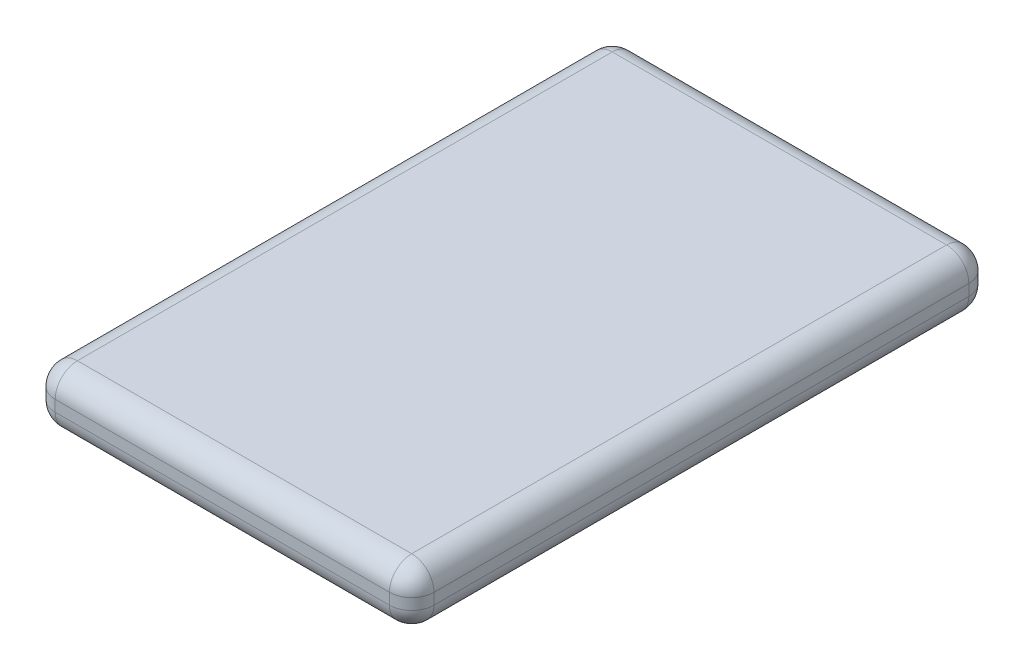
ISO-10303-21;
HEADER;
FILE_DESCRIPTION(('STEP AP214'),'2;1');
FILE_NAME('part.step','',(''),(''),'','','');
FILE_SCHEMA(('AUTOMOTIVE_DESIGN { 1 0 10303 214 1 1 1 1 }'));
ENDSEC;
DATA;
#1=APPLICATION_CONTEXT('core data for automotive mechanical design processes');
#2=APPLICATION_PROTOCOL_DEFINITION('international standard','automotive_design',2000,#1);
#3=PRODUCT_CONTEXT('',#1,'mechanical');
#4=PRODUCT('Part','Part','',(#3));
#5=PRODUCT_RELATED_PRODUCT_CATEGORY('part','',(#4));
#6=PRODUCT_DEFINITION_FORMATION('','',#4);
#7=PRODUCT_DEFINITION_CONTEXT('part definition',#1,'design');
#8=PRODUCT_DEFINITION('design','',#6,#7);
#9=PRODUCT_DEFINITION_SHAPE('','',#8);
#10=(LENGTH_UNIT() NAMED_UNIT(*) SI_UNIT(.MILLI.,.METRE.));
#11=(NAMED_UNIT(*) PLANE_ANGLE_UNIT() SI_UNIT($,.RADIAN.));
#12=(NAMED_UNIT(*) SI_UNIT($,.STERADIAN.) SOLID_ANGLE_UNIT());
#13=UNCERTAINTY_MEASURE_WITH_UNIT(LENGTH_MEASURE(1.E-05),#10,'distance_accuracy_value','');
#14=(GEOMETRIC_REPRESENTATION_CONTEXT(3) GLOBAL_UNCERTAINTY_ASSIGNED_CONTEXT((#13)) GLOBAL_UNIT_ASSIGNED_CONTEXT((#10,
#11,#12)) REPRESENTATION_CONTEXT('',''));
#15=CARTESIAN_POINT('',(0.,0.,0.));
#16=DIRECTION('',(0.,0.,1.));
#17=DIRECTION('',(1.,0.,0.));
#18=AXIS2_PLACEMENT_3D('',#15,#16,#17);
#19=CARTESIAN_POINT('',(0.,5.,0.));
#20=DIRECTION('',(1.,0.,0.));
#21=DIRECTION('',(0.,0.,-1.));
#22=AXIS2_PLACEMENT_3D('',#19,#20,#21);
#23=PLANE('',#22);
#24=DIRECTION('',(0.,-1.,0.));
#25=VECTOR('',#24,1.);
#26=CARTESIAN_POINT('',(0.,5.,-2.));
#27=LINE('',#26,#25);
#28=CARTESIAN_POINT('',(0.,2.,-2.));
#29=VERTEX_POINT('',#28);
#30=CARTESIAN_POINT('',(0.,3.,-2.));
#31=VERTEX_POINT('',#30);
#32=EDGE_CURVE('E219',#29,#31,#27,.F.);
#33=ORIENTED_EDGE('',*,*,#32,.T.);
#34=DIRECTION('',(0.,0.,1.));
#35=VECTOR('',#34,1.);
#36=CARTESIAN_POINT('',(0.,3.,0.));
#37=LINE('',#36,#35);
#38=CARTESIAN_POINT('',(0.,3.,-50.));
#39=VERTEX_POINT('',#38);
#40=EDGE_CURVE('E222',#31,#39,#37,.F.);
#41=ORIENTED_EDGE('',*,*,#40,.T.);
#42=DIRECTION('',(0.,-1.,0.));
#43=VECTOR('',#42,1.);
#44=CARTESIAN_POINT('',(0.,5.,-50.));
#45=LINE('',#44,#43);
#46=CARTESIAN_POINT('',(0.,2.,-50.));
#47=VERTEX_POINT('',#46);
#48=EDGE_CURVE('E213',#39,#47,#45,.T.);
#49=ORIENTED_EDGE('',*,*,#48,.T.);
#50=DIRECTION('',(0.,0.,1.));
#51=VECTOR('',#50,1.);
#52=CARTESIAN_POINT('',(0.,2.,0.));
#53=LINE('',#52,#51);
#54=EDGE_CURVE('E216',#47,#29,#53,.T.);
#55=ORIENTED_EDGE('',*,*,#54,.T.);
#56=EDGE_LOOP('',(#33,#41,#49,#55));
#57=FACE_BOUND('',#56,.T.);
#58=ADVANCED_FACE('F43',(#57),#23,.F.);
#59=CARTESIAN_POINT('',(0.,5.,0.));
#60=DIRECTION('',(0.,0.,-1.));
#61=DIRECTION('',(-1.,0.,0.));
#62=AXIS2_PLACEMENT_3D('',#59,#60,#61);
#63=PLANE('',#62);
#64=DIRECTION('',(0.,-1.,0.));
#65=VECTOR('',#64,1.);
#66=CARTESIAN_POINT('',(32.,5.,0.));
#67=LINE('',#66,#65);
#68=CARTESIAN_POINT('',(32.,2.,0.));
#69=VERTEX_POINT('',#68);
#70=CARTESIAN_POINT('',(32.,3.,0.));
#71=VERTEX_POINT('',#70);
#72=EDGE_CURVE('E206',#69,#71,#67,.F.);
#73=ORIENTED_EDGE('',*,*,#72,.T.);
#74=DIRECTION('',(1.,0.,0.));
#75=VECTOR('',#74,1.);
#76=CARTESIAN_POINT('',(0.,3.,0.));
#77=LINE('',#76,#75);
#78=CARTESIAN_POINT('',(2.,3.,0.));
#79=VERTEX_POINT('',#78);
#80=EDGE_CURVE('E209',#71,#79,#77,.F.);
#81=ORIENTED_EDGE('',*,*,#80,.T.);
#82=DIRECTION('',(0.,-1.,0.));
#83=VECTOR('',#82,1.);
#84=CARTESIAN_POINT('',(2.,5.,0.));
#85=LINE('',#84,#83);
#86=CARTESIAN_POINT('',(2.,2.,0.));
#87=VERTEX_POINT('',#86);
#88=EDGE_CURVE('E200',#79,#87,#85,.T.);
#89=ORIENTED_EDGE('',*,*,#88,.T.);
#90=DIRECTION('',(1.,0.,0.));
#91=VECTOR('',#90,1.);
#92=CARTESIAN_POINT('',(34.,2.,0.));
#93=LINE('',#92,#91);
#94=EDGE_CURVE('E203',#87,#69,#93,.T.);
#95=ORIENTED_EDGE('',*,*,#94,.T.);
#96=EDGE_LOOP('',(#73,#81,#89,#95));
#97=FACE_BOUND('',#96,.T.);
#98=ADVANCED_FACE('F326',(#97),#63,.F.);
#99=CARTESIAN_POINT('',(34.,5.,0.));
#100=DIRECTION('',(-1.,0.,0.));
#101=DIRECTION('',(0.,0.,1.));
#102=AXIS2_PLACEMENT_3D('',#99,#100,#101);
#103=PLANE('',#102);
#104=DIRECTION('',(0.,0.,-1.));
#105=VECTOR('',#104,1.);
#106=CARTESIAN_POINT('',(34.,3.,0.));
#107=LINE('',#106,#105);
#108=CARTESIAN_POINT('',(34.,3.,-50.));
#109=VERTEX_POINT('',#108);
#110=CARTESIAN_POINT('',(34.,3.,-2.));
#111=VERTEX_POINT('',#110);
#112=EDGE_CURVE('E140',#109,#111,#107,.F.);
#113=ORIENTED_EDGE('',*,*,#112,.T.);
#114=DIRECTION('',(0.,-1.,0.));
#115=VECTOR('',#114,1.);
#116=CARTESIAN_POINT('',(34.,5.,-2.));
#117=LINE('',#116,#115);
#118=CARTESIAN_POINT('',(34.,2.,-2.));
#119=VERTEX_POINT('',#118);
#120=EDGE_CURVE('E184',#111,#119,#117,.T.);
#121=ORIENTED_EDGE('',*,*,#120,.T.);
#122=DIRECTION('',(0.,0.,-1.));
#123=VECTOR('',#122,1.);
#124=CARTESIAN_POINT('',(34.,2.,-52.));
#125=LINE('',#124,#123);
#126=CARTESIAN_POINT('',(34.,2.,-50.));
#127=VERTEX_POINT('',#126);
#128=EDGE_CURVE('E175',#119,#127,#125,.T.);
#129=ORIENTED_EDGE('',*,*,#128,.T.);
#130=DIRECTION('',(0.,-1.,0.));
#131=VECTOR('',#130,1.);
#132=CARTESIAN_POINT('',(34.,5.,-50.));
#133=LINE('',#132,#131);
#134=EDGE_CURVE('E171',#127,#109,#133,.F.);
#135=ORIENTED_EDGE('',*,*,#134,.T.);
#136=EDGE_LOOP('',(#113,#121,#129,#135));
#137=FACE_BOUND('',#136,.T.);
#138=ADVANCED_FACE('F387',(#137),#103,.F.);
#139=CARTESIAN_POINT('',(0.,5.,-52.));
#140=DIRECTION('',(0.,0.,1.));
#141=DIRECTION('',(1.,0.,0.));
#142=AXIS2_PLACEMENT_3D('',#139,#140,#141);
#143=PLANE('',#142);
#144=DIRECTION('',(-1.,0.,0.));
#145=VECTOR('',#144,1.);
#146=CARTESIAN_POINT('',(0.,3.,-52.));
#147=LINE('',#146,#145);
#148=CARTESIAN_POINT('',(2.,3.,-52.));
#149=VERTEX_POINT('',#148);
#150=CARTESIAN_POINT('',(32.,3.,-52.));
#151=VERTEX_POINT('',#150);
#152=EDGE_CURVE('E53',#149,#151,#147,.F.);
#153=ORIENTED_EDGE('',*,*,#152,.T.);
#154=DIRECTION('',(0.,-1.,0.));
#155=VECTOR('',#154,1.);
#156=CARTESIAN_POINT('',(32.,5.,-52.));
#157=LINE('',#156,#155);
#158=CARTESIAN_POINT('',(32.,2.,-52.));
#159=VERTEX_POINT('',#158);
#160=EDGE_CURVE('E11',#151,#159,#157,.T.);
#161=ORIENTED_EDGE('',*,*,#160,.T.);
#162=DIRECTION('',(-1.,0.,0.));
#163=VECTOR('',#162,1.);
#164=CARTESIAN_POINT('',(0.,2.,-52.));
#165=LINE('',#164,#163);
#166=CARTESIAN_POINT('',(2.,2.,-52.));
#167=VERTEX_POINT('',#166);
#168=EDGE_CURVE('E226',#159,#167,#165,.T.);
#169=ORIENTED_EDGE('',*,*,#168,.T.);
#170=DIRECTION('',(0.,-1.,0.));
#171=VECTOR('',#170,1.);
#172=CARTESIAN_POINT('',(2.,5.,-52.));
#173=LINE('',#172,#171);
#174=EDGE_CURVE('E64',#167,#149,#173,.F.);
#175=ORIENTED_EDGE('',*,*,#174,.T.);
#176=EDGE_LOOP('',(#153,#161,#169,#175));
#177=FACE_BOUND('',#176,.T.);
#178=ADVANCED_FACE('F414',(#177),#143,.F.);
#179=CARTESIAN_POINT('',(0.,5.,0.));
#180=DIRECTION('',(0.,-1.,0.));
#181=DIRECTION('',(0.,0.,-1.));
#182=AXIS2_PLACEMENT_3D('',#179,#180,#181);
#183=PLANE('',#182);
#184=DIRECTION('',(1.,0.,0.));
#185=VECTOR('',#184,1.);
#186=CARTESIAN_POINT('',(0.,5.,-2.));
#187=LINE('',#186,#185);
#188=CARTESIAN_POINT('',(2.,5.,-2.));
#189=VERTEX_POINT('',#188);
#190=CARTESIAN_POINT('',(32.,5.,-2.));
#191=VERTEX_POINT('',#190);
#192=EDGE_CURVE('E168',#189,#191,#187,.T.);
#193=ORIENTED_EDGE('',*,*,#192,.T.);
#194=DIRECTION('',(0.,0.,-1.));
#195=VECTOR('',#194,1.);
#196=CARTESIAN_POINT('',(32.,5.,0.));
#197=LINE('',#196,#195);
#198=CARTESIAN_POINT('',(32.,5.,-50.));
#199=VERTEX_POINT('',#198);
#200=EDGE_CURVE('E138',#191,#199,#197,.T.);
#201=ORIENTED_EDGE('',*,*,#200,.T.);
#202=DIRECTION('',(-1.,0.,0.));
#203=VECTOR('',#202,1.);
#204=CARTESIAN_POINT('',(0.,5.,-50.));
#205=LINE('',#204,#203);
#206=CARTESIAN_POINT('',(2.,5.,-50.));
#207=VERTEX_POINT('',#206);
#208=EDGE_CURVE('E157',#199,#207,#205,.T.);
#209=ORIENTED_EDGE('',*,*,#208,.T.);
#210=DIRECTION('',(0.,0.,1.));
#211=VECTOR('',#210,1.);
#212=CARTESIAN_POINT('',(2.,5.,0.));
#213=LINE('',#212,#211);
#214=EDGE_CURVE('E164',#207,#189,#213,.T.);
#215=ORIENTED_EDGE('',*,*,#214,.T.);
#216=EDGE_LOOP('',(#193,#201,#209,#215));
#217=FACE_BOUND('',#216,.T.);
#218=ADVANCED_FACE('F166',(#217),#183,.F.);
#219=CARTESIAN_POINT('',(0.,0.,0.));
#220=DIRECTION('',(0.,-1.,0.));
#221=DIRECTION('',(0.,0.,-1.));
#222=AXIS2_PLACEMENT_3D('',#219,#220,#221);
#223=PLANE('',#222);
#224=DIRECTION('',(-1.,0.,0.));
#225=VECTOR('',#224,1.);
#226=CARTESIAN_POINT('',(34.,0.,-50.));
#227=LINE('',#226,#225);
#228=CARTESIAN_POINT('',(2.,0.,-50.));
#229=VERTEX_POINT('',#228);
#230=CARTESIAN_POINT('',(32.,0.,-50.));
#231=VERTEX_POINT('',#230);
#232=EDGE_CURVE('E187',#229,#231,#227,.F.);
#233=ORIENTED_EDGE('',*,*,#232,.T.);
#234=DIRECTION('',(0.,0.,-1.));
#235=VECTOR('',#234,1.);
#236=CARTESIAN_POINT('',(32.,0.,0.));
#237=LINE('',#236,#235);
#238=CARTESIAN_POINT('',(32.,0.,-2.));
#239=VERTEX_POINT('',#238);
#240=EDGE_CURVE('E196',#231,#239,#237,.F.);
#241=ORIENTED_EDGE('',*,*,#240,.T.);
#242=DIRECTION('',(1.,0.,0.));
#243=VECTOR('',#242,1.);
#244=CARTESIAN_POINT('',(0.,0.,-2.));
#245=LINE('',#244,#243);
#246=CARTESIAN_POINT('',(2.,0.,-2.));
#247=VERTEX_POINT('',#246);
#248=EDGE_CURVE('E193',#239,#247,#245,.F.);
#249=ORIENTED_EDGE('',*,*,#248,.T.);
#250=DIRECTION('',(0.,0.,1.));
#251=VECTOR('',#250,1.);
#252=CARTESIAN_POINT('',(2.,0.,-52.));
#253=LINE('',#252,#251);
#254=EDGE_CURVE('E190',#247,#229,#253,.F.);
#255=ORIENTED_EDGE('',*,*,#254,.T.);
#256=EDGE_LOOP('',(#233,#241,#249,#255));
#257=FACE_BOUND('',#256,.T.);
#258=ADVANCED_FACE('F352',(#257),#223,.T.);
#259=CARTESIAN_POINT('',(2.,2.,0.));
#260=DIRECTION('',(0.,0.,-1.));
#261=DIRECTION('',(-1.,0.,0.));
#262=AXIS2_PLACEMENT_3D('',#259,#260,#261);
#263=CYLINDRICAL_SURFACE('',#262,2.);
#264=CARTESIAN_POINT('',(2.,2.,-2.));
#265=DIRECTION('',(0.,0.,1.));
#266=DIRECTION('',(1.,0.,0.));
#267=AXIS2_PLACEMENT_3D('',#264,#265,#266);
#268=CIRCLE('',#267,2.);
#269=EDGE_CURVE('E47',#29,#247,#268,.T.);
#270=ORIENTED_EDGE('',*,*,#269,.F.);
#271=ORIENTED_EDGE('',*,*,#54,.F.);
#272=CARTESIAN_POINT('',(2.,2.,-50.));
#273=DIRECTION('',(0.,0.,-1.));
#274=DIRECTION('',(-1.,0.,0.));
#275=AXIS2_PLACEMENT_3D('',#272,#273,#274);
#276=CIRCLE('',#275,2.);
#277=EDGE_CURVE('E301',#229,#47,#276,.T.);
#278=ORIENTED_EDGE('',*,*,#277,.F.);
#279=ORIENTED_EDGE('',*,*,#254,.F.);
#280=EDGE_LOOP('',(#270,#271,#278,#279));
#281=FACE_BOUND('',#280,.T.);
#282=ADVANCED_FACE('F45',(#281),#263,.T.);
#283=CARTESIAN_POINT('',(2.,2.,-2.));
#284=DIRECTION('',(0.,-1.,0.));
#285=DIRECTION('',(0.,0.,-1.));
#286=AXIS2_PLACEMENT_3D('',#283,#284,#285);
#287=SPHERICAL_SURFACE('',#286,2.);
#288=CARTESIAN_POINT('',(2.,2.,-2.));
#289=DIRECTION('',(0.,-1.,0.));
#290=DIRECTION('',(0.,0.,-1.));
#291=AXIS2_PLACEMENT_3D('',#288,#289,#290);
#292=CIRCLE('',#291,2.);
#293=EDGE_CURVE('E294',#29,#87,#292,.F.);
#294=ORIENTED_EDGE('',*,*,#293,.F.);
#295=ORIENTED_EDGE('',*,*,#269,.T.);
#296=CARTESIAN_POINT('',(2.,2.,-2.));
#297=DIRECTION('',(-1.,0.,0.));
#298=DIRECTION('',(0.,0.,1.));
#299=AXIS2_PLACEMENT_3D('',#296,#297,#298);
#300=CIRCLE('',#299,2.);
#301=EDGE_CURVE('E298',#87,#247,#300,.F.);
#302=ORIENTED_EDGE('',*,*,#301,.F.);
#303=EDGE_LOOP('',(#294,#295,#302));
#304=FACE_BOUND('',#303,.T.);
#305=ADVANCED_FACE('F314',(#304),#287,.T.);
#306=CARTESIAN_POINT('',(2.,2.,-50.));
#307=DIRECTION('',(-1.,0.,0.));
#308=DIRECTION('',(0.,0.,1.));
#309=AXIS2_PLACEMENT_3D('',#306,#307,#308);
#310=SPHERICAL_SURFACE('',#309,2.);
#311=CARTESIAN_POINT('',(2.,2.,-50.));
#312=DIRECTION('',(-1.,0.,0.));
#313=DIRECTION('',(0.,0.,1.));
#314=AXIS2_PLACEMENT_3D('',#311,#312,#313);
#315=CIRCLE('',#314,2.);
#316=EDGE_CURVE('E286',#229,#167,#315,.F.);
#317=ORIENTED_EDGE('',*,*,#316,.F.);
#318=ORIENTED_EDGE('',*,*,#277,.T.);
#319=CARTESIAN_POINT('',(2.,2.,-50.));
#320=DIRECTION('',(0.,-1.,0.));
#321=DIRECTION('',(0.,0.,-1.));
#322=AXIS2_PLACEMENT_3D('',#319,#320,#321);
#323=CIRCLE('',#322,2.);
#324=EDGE_CURVE('E290',#167,#47,#323,.F.);
#325=ORIENTED_EDGE('',*,*,#324,.F.);
#326=EDGE_LOOP('',(#317,#318,#325));
#327=FACE_BOUND('',#326,.T.);
#328=ADVANCED_FACE('F345',(#327),#310,.T.);
#329=CARTESIAN_POINT('',(0.,2.,-2.));
#330=DIRECTION('',(-1.,0.,0.));
#331=DIRECTION('',(0.,0.,1.));
#332=AXIS2_PLACEMENT_3D('',#329,#330,#331);
#333=CYLINDRICAL_SURFACE('',#332,2.);
#334=ORIENTED_EDGE('',*,*,#301,.T.);
#335=ORIENTED_EDGE('',*,*,#248,.F.);
#336=CARTESIAN_POINT('',(32.,2.,-2.));
#337=DIRECTION('',(1.,0.,0.));
#338=DIRECTION('',(0.,0.,-1.));
#339=AXIS2_PLACEMENT_3D('',#336,#337,#338);
#340=CIRCLE('',#339,2.);
#341=EDGE_CURVE('E279',#69,#239,#340,.T.);
#342=ORIENTED_EDGE('',*,*,#341,.F.);
#343=ORIENTED_EDGE('',*,*,#94,.F.);
#344=EDGE_LOOP('',(#334,#335,#342,#343));
#345=FACE_BOUND('',#344,.T.);
#346=ADVANCED_FACE('F322',(#345),#333,.T.);
#347=CARTESIAN_POINT('',(2.,5.,-2.));
#348=DIRECTION('',(0.,-1.,0.));
#349=DIRECTION('',(0.,0.,-1.));
#350=AXIS2_PLACEMENT_3D('',#347,#348,#349);
#351=CYLINDRICAL_SURFACE('',#350,2.);
#352=ORIENTED_EDGE('',*,*,#293,.T.);
#353=ORIENTED_EDGE('',*,*,#88,.F.);
#354=CARTESIAN_POINT('',(2.,3.,-2.));
#355=DIRECTION('',(0.,1.,0.));
#356=DIRECTION('',(0.,0.,1.));
#357=AXIS2_PLACEMENT_3D('',#354,#355,#356);
#358=CIRCLE('',#357,2.);
#359=EDGE_CURVE('E275',#31,#79,#358,.T.);
#360=ORIENTED_EDGE('',*,*,#359,.F.);
#361=ORIENTED_EDGE('',*,*,#32,.F.);
#362=EDGE_LOOP('',(#352,#353,#360,#361));
#363=FACE_BOUND('',#362,.T.);
#364=ADVANCED_FACE('F332',(#363),#351,.T.);
#365=CARTESIAN_POINT('',(2.,3.,0.));
#366=DIRECTION('',(0.,0.,1.));
#367=DIRECTION('',(1.,0.,0.));
#368=AXIS2_PLACEMENT_3D('',#365,#366,#367);
#369=CYLINDRICAL_SURFACE('',#368,2.);
#370=CARTESIAN_POINT('',(2.,3.,-50.));
#371=DIRECTION('',(0.,0.,-1.));
#372=DIRECTION('',(-1.,0.,0.));
#373=AXIS2_PLACEMENT_3D('',#370,#371,#372);
#374=CIRCLE('',#373,2.);
#375=EDGE_CURVE('E267',#39,#207,#374,.T.);
#376=ORIENTED_EDGE('',*,*,#375,.F.);
#377=ORIENTED_EDGE('',*,*,#40,.F.);
#378=CARTESIAN_POINT('',(2.,3.,-2.));
#379=DIRECTION('',(0.,0.,1.));
#380=DIRECTION('',(1.,0.,0.));
#381=AXIS2_PLACEMENT_3D('',#378,#379,#380);
#382=CIRCLE('',#381,2.);
#383=EDGE_CURVE('E271',#189,#31,#382,.T.);
#384=ORIENTED_EDGE('',*,*,#383,.F.);
#385=ORIENTED_EDGE('',*,*,#214,.F.);
#386=EDGE_LOOP('',(#376,#377,#384,#385));
#387=FACE_BOUND('',#386,.T.);
#388=ADVANCED_FACE('F338',(#387),#369,.T.);
#389=CARTESIAN_POINT('',(2.,5.,-50.));
#390=DIRECTION('',(0.,-1.,0.));
#391=DIRECTION('',(0.,0.,-1.));
#392=AXIS2_PLACEMENT_3D('',#389,#390,#391);
#393=CYLINDRICAL_SURFACE('',#392,2.);
#394=ORIENTED_EDGE('',*,*,#324,.T.);
#395=ORIENTED_EDGE('',*,*,#48,.F.);
#396=CARTESIAN_POINT('',(2.,3.,-50.));
#397=DIRECTION('',(0.,1.,0.));
#398=DIRECTION('',(0.,0.,1.));
#399=AXIS2_PLACEMENT_3D('',#396,#397,#398);
#400=CIRCLE('',#399,2.);
#401=EDGE_CURVE('E264',#149,#39,#400,.T.);
#402=ORIENTED_EDGE('',*,*,#401,.F.);
#403=ORIENTED_EDGE('',*,*,#174,.F.);
#404=EDGE_LOOP('',(#394,#395,#402,#403));
#405=FACE_BOUND('',#404,.T.);
#406=ADVANCED_FACE('F343',(#405),#393,.T.);
#407=CARTESIAN_POINT('',(0.,2.,-50.));
#408=DIRECTION('',(1.,0.,0.));
#409=DIRECTION('',(0.,0.,-1.));
#410=AXIS2_PLACEMENT_3D('',#407,#408,#409);
#411=CYLINDRICAL_SURFACE('',#410,2.);
#412=ORIENTED_EDGE('',*,*,#316,.T.);
#413=ORIENTED_EDGE('',*,*,#168,.F.);
#414=CARTESIAN_POINT('',(32.,2.,-50.));
#415=DIRECTION('',(1.,0.,0.));
#416=DIRECTION('',(0.,0.,-1.));
#417=AXIS2_PLACEMENT_3D('',#414,#415,#416);
#418=CIRCLE('',#417,2.);
#419=EDGE_CURVE('E260',#231,#159,#418,.T.);
#420=ORIENTED_EDGE('',*,*,#419,.F.);
#421=ORIENTED_EDGE('',*,*,#232,.F.);
#422=EDGE_LOOP('',(#412,#413,#420,#421));
#423=FACE_BOUND('',#422,.T.);
#424=ADVANCED_FACE('F349',(#423),#411,.T.);
#425=CARTESIAN_POINT('',(32.,2.,0.));
#426=DIRECTION('',(0.,0.,1.));
#427=DIRECTION('',(1.,0.,0.));
#428=AXIS2_PLACEMENT_3D('',#425,#426,#427);
#429=CYLINDRICAL_SURFACE('',#428,2.);
#430=CARTESIAN_POINT('',(32.,2.,-2.));
#431=DIRECTION('',(0.,0.,1.));
#432=DIRECTION('',(1.,0.,0.));
#433=AXIS2_PLACEMENT_3D('',#430,#431,#432);
#434=CIRCLE('',#433,2.);
#435=EDGE_CURVE('E282',#239,#119,#434,.T.);
#436=ORIENTED_EDGE('',*,*,#435,.F.);
#437=ORIENTED_EDGE('',*,*,#240,.F.);
#438=CARTESIAN_POINT('',(32.,2.,-50.));
#439=DIRECTION('',(0.,0.,-1.));
#440=DIRECTION('',(-1.,0.,0.));
#441=AXIS2_PLACEMENT_3D('',#438,#439,#440);
#442=CIRCLE('',#441,2.);
#443=EDGE_CURVE('E256',#127,#231,#442,.T.);
#444=ORIENTED_EDGE('',*,*,#443,.F.);
#445=ORIENTED_EDGE('',*,*,#128,.F.);
#446=EDGE_LOOP('',(#436,#437,#444,#445));
#447=FACE_BOUND('',#446,.T.);
#448=ADVANCED_FACE('F356',(#447),#429,.T.);
#449=CARTESIAN_POINT('',(32.,2.,-2.));
#450=DIRECTION('',(0.,-1.,0.));
#451=DIRECTION('',(0.,0.,-1.));
#452=AXIS2_PLACEMENT_3D('',#449,#450,#451);
#453=SPHERICAL_SURFACE('',#452,2.);
#454=ORIENTED_EDGE('',*,*,#341,.T.);
#455=ORIENTED_EDGE('',*,*,#435,.T.);
#456=CARTESIAN_POINT('',(32.,2.,-2.));
#457=DIRECTION('',(0.,-1.,0.));
#458=DIRECTION('',(0.,0.,-1.));
#459=AXIS2_PLACEMENT_3D('',#456,#457,#458);
#460=CIRCLE('',#459,2.);
#461=EDGE_CURVE('E252',#69,#119,#460,.F.);
#462=ORIENTED_EDGE('',*,*,#461,.F.);
#463=EDGE_LOOP('',(#454,#455,#462));
#464=FACE_BOUND('',#463,.T.);
#465=ADVANCED_FACE('F360',(#464),#453,.T.);
#466=CARTESIAN_POINT('',(2.,3.,-2.));
#467=DIRECTION('',(-1.,0.,0.));
#468=DIRECTION('',(0.,0.,1.));
#469=AXIS2_PLACEMENT_3D('',#466,#467,#468);
#470=SPHERICAL_SURFACE('',#469,2.);
#471=ORIENTED_EDGE('',*,*,#383,.T.);
#472=ORIENTED_EDGE('',*,*,#359,.T.);
#473=CARTESIAN_POINT('',(2.,3.,-2.));
#474=DIRECTION('',(-1.,0.,0.));
#475=DIRECTION('',(0.,0.,1.));
#476=AXIS2_PLACEMENT_3D('',#473,#474,#475);
#477=CIRCLE('',#476,2.);
#478=EDGE_CURVE('E249',#189,#79,#477,.F.);
#479=ORIENTED_EDGE('',*,*,#478,.F.);
#480=EDGE_LOOP('',(#471,#472,#479));
#481=FACE_BOUND('',#480,.T.);
#482=ADVANCED_FACE('F371',(#481),#470,.T.);
#483=CARTESIAN_POINT('',(2.,3.,-50.));
#484=DIRECTION('',(-1.,0.,0.));
#485=DIRECTION('',(0.,0.,1.));
#486=AXIS2_PLACEMENT_3D('',#483,#484,#485);
#487=SPHERICAL_SURFACE('',#486,2.);
#488=ORIENTED_EDGE('',*,*,#401,.T.);
#489=ORIENTED_EDGE('',*,*,#375,.T.);
#490=CARTESIAN_POINT('',(2.,3.,-50.));
#491=DIRECTION('',(-1.,0.,0.));
#492=DIRECTION('',(0.,0.,1.));
#493=AXIS2_PLACEMENT_3D('',#490,#491,#492);
#494=CIRCLE('',#493,2.);
#495=EDGE_CURVE('E160',#149,#207,#494,.F.);
#496=ORIENTED_EDGE('',*,*,#495,.F.);
#497=EDGE_LOOP('',(#488,#489,#496));
#498=FACE_BOUND('',#497,.T.);
#499=ADVANCED_FACE('F373',(#498),#487,.T.);
#500=CARTESIAN_POINT('',(32.,2.,-50.));
#501=DIRECTION('',(0.,-1.,0.));
#502=DIRECTION('',(0.,0.,-1.));
#503=AXIS2_PLACEMENT_3D('',#500,#501,#502);
#504=SPHERICAL_SURFACE('',#503,2.);
#505=ORIENTED_EDGE('',*,*,#443,.T.);
#506=ORIENTED_EDGE('',*,*,#419,.T.);
#507=CARTESIAN_POINT('',(32.,2.,-50.));
#508=DIRECTION('',(0.,-1.,0.));
#509=DIRECTION('',(0.,0.,-1.));
#510=AXIS2_PLACEMENT_3D('',#507,#508,#509);
#511=CIRCLE('',#510,2.);
#512=EDGE_CURVE('E244',#127,#159,#511,.F.);
#513=ORIENTED_EDGE('',*,*,#512,.F.);
#514=EDGE_LOOP('',(#505,#506,#513));
#515=FACE_BOUND('',#514,.T.);
#516=ADVANCED_FACE('F379',(#515),#504,.T.);
#517=CARTESIAN_POINT('',(32.,5.,-2.));
#518=DIRECTION('',(0.,-1.,0.));
#519=DIRECTION('',(0.,0.,-1.));
#520=AXIS2_PLACEMENT_3D('',#517,#518,#519);
#521=CYLINDRICAL_SURFACE('',#520,2.);
#522=ORIENTED_EDGE('',*,*,#461,.T.);
#523=ORIENTED_EDGE('',*,*,#120,.F.);
#524=CARTESIAN_POINT('',(32.,3.,-2.));
#525=DIRECTION('',(0.,1.,0.));
#526=DIRECTION('',(0.,0.,1.));
#527=AXIS2_PLACEMENT_3D('',#524,#525,#526);
#528=CIRCLE('',#527,2.);
#529=EDGE_CURVE('E240',#71,#111,#528,.T.);
#530=ORIENTED_EDGE('',*,*,#529,.F.);
#531=ORIENTED_EDGE('',*,*,#72,.F.);
#532=EDGE_LOOP('',(#522,#523,#530,#531));
#533=FACE_BOUND('',#532,.T.);
#534=ADVANCED_FACE('F363',(#533),#521,.T.);
#535=CARTESIAN_POINT('',(0.,3.,-2.));
#536=DIRECTION('',(1.,0.,0.));
#537=DIRECTION('',(0.,0.,-1.));
#538=AXIS2_PLACEMENT_3D('',#535,#536,#537);
#539=CYLINDRICAL_SURFACE('',#538,2.);
#540=ORIENTED_EDGE('',*,*,#478,.T.);
#541=ORIENTED_EDGE('',*,*,#80,.F.);
#542=CARTESIAN_POINT('',(32.,3.,-2.));
#543=DIRECTION('',(1.,0.,0.));
#544=DIRECTION('',(0.,0.,-1.));
#545=AXIS2_PLACEMENT_3D('',#542,#543,#544);
#546=CIRCLE('',#545,2.);
#547=EDGE_CURVE('E154',#191,#71,#546,.T.);
#548=ORIENTED_EDGE('',*,*,#547,.F.);
#549=ORIENTED_EDGE('',*,*,#192,.F.);
#550=EDGE_LOOP('',(#540,#541,#548,#549));
#551=FACE_BOUND('',#550,.T.);
#552=ADVANCED_FACE('F369',(#551),#539,.T.);
#553=CARTESIAN_POINT('',(0.,3.,-50.));
#554=DIRECTION('',(-1.,0.,0.));
#555=DIRECTION('',(0.,0.,1.));
#556=AXIS2_PLACEMENT_3D('',#553,#554,#555);
#557=CYLINDRICAL_SURFACE('',#556,2.);
#558=ORIENTED_EDGE('',*,*,#495,.T.);
#559=ORIENTED_EDGE('',*,*,#208,.F.);
#560=CARTESIAN_POINT('',(32.,3.,-50.));
#561=DIRECTION('',(1.,0.,0.));
#562=DIRECTION('',(0.,0.,-1.));
#563=AXIS2_PLACEMENT_3D('',#560,#561,#562);
#564=CIRCLE('',#563,2.);
#565=EDGE_CURVE('E147',#151,#199,#564,.T.);
#566=ORIENTED_EDGE('',*,*,#565,.F.);
#567=ORIENTED_EDGE('',*,*,#152,.F.);
#568=EDGE_LOOP('',(#558,#559,#566,#567));
#569=FACE_BOUND('',#568,.T.);
#570=ADVANCED_FACE('F158',(#569),#557,.T.);
#571=CARTESIAN_POINT('',(32.,5.,-50.));
#572=DIRECTION('',(0.,-1.,0.));
#573=DIRECTION('',(0.,0.,-1.));
#574=AXIS2_PLACEMENT_3D('',#571,#572,#573);
#575=CYLINDRICAL_SURFACE('',#574,2.);
#576=ORIENTED_EDGE('',*,*,#512,.T.);
#577=ORIENTED_EDGE('',*,*,#160,.F.);
#578=CARTESIAN_POINT('',(32.,3.,-50.));
#579=DIRECTION('',(0.,1.,0.));
#580=DIRECTION('',(0.,0.,1.));
#581=AXIS2_PLACEMENT_3D('',#578,#579,#580);
#582=CIRCLE('',#581,2.);
#583=EDGE_CURVE('E151',#109,#151,#582,.T.);
#584=ORIENTED_EDGE('',*,*,#583,.F.);
#585=ORIENTED_EDGE('',*,*,#134,.F.);
#586=EDGE_LOOP('',(#576,#577,#584,#585));
#587=FACE_BOUND('',#586,.T.);
#588=ADVANCED_FACE('F397',(#587),#575,.T.);
#589=CARTESIAN_POINT('',(32.,3.,-2.));
#590=DIRECTION('',(0.,0.,1.));
#591=DIRECTION('',(1.,0.,0.));
#592=AXIS2_PLACEMENT_3D('',#589,#590,#591);
#593=SPHERICAL_SURFACE('',#592,2.);
#594=ORIENTED_EDGE('',*,*,#547,.T.);
#595=ORIENTED_EDGE('',*,*,#529,.T.);
#596=CARTESIAN_POINT('',(32.,3.,-2.));
#597=DIRECTION('',(0.,0.,1.));
#598=DIRECTION('',(1.,0.,0.));
#599=AXIS2_PLACEMENT_3D('',#596,#597,#598);
#600=CIRCLE('',#599,2.);
#601=EDGE_CURVE('E144',#191,#111,#600,.F.);
#602=ORIENTED_EDGE('',*,*,#601,.F.);
#603=EDGE_LOOP('',(#594,#595,#602));
#604=FACE_BOUND('',#603,.T.);
#605=ADVANCED_FACE('F367',(#604),#593,.T.);
#606=CARTESIAN_POINT('',(32.,3.,-50.));
#607=DIRECTION('',(0.,0.,-1.));
#608=DIRECTION('',(-1.,0.,0.));
#609=AXIS2_PLACEMENT_3D('',#606,#607,#608);
#610=SPHERICAL_SURFACE('',#609,2.);
#611=ORIENTED_EDGE('',*,*,#583,.T.);
#612=ORIENTED_EDGE('',*,*,#565,.T.);
#613=CARTESIAN_POINT('',(32.,3.,-50.));
#614=DIRECTION('',(0.,0.,-1.));
#615=DIRECTION('',(-1.,0.,0.));
#616=AXIS2_PLACEMENT_3D('',#613,#614,#615);
#617=CIRCLE('',#616,2.);
#618=EDGE_CURVE('E134',#109,#199,#617,.F.);
#619=ORIENTED_EDGE('',*,*,#618,.F.);
#620=EDGE_LOOP('',(#611,#612,#619));
#621=FACE_BOUND('',#620,.T.);
#622=ADVANCED_FACE('F149',(#621),#610,.T.);
#623=CARTESIAN_POINT('',(32.,3.,0.));
#624=DIRECTION('',(0.,0.,-1.));
#625=DIRECTION('',(-1.,0.,0.));
#626=AXIS2_PLACEMENT_3D('',#623,#624,#625);
#627=CYLINDRICAL_SURFACE('',#626,2.);
#628=ORIENTED_EDGE('',*,*,#601,.T.);
#629=ORIENTED_EDGE('',*,*,#112,.F.);
#630=ORIENTED_EDGE('',*,*,#618,.T.);
#631=ORIENTED_EDGE('',*,*,#200,.F.);
#632=EDGE_LOOP('',(#628,#629,#630,#631));
#633=FACE_BOUND('',#632,.T.);
#634=ADVANCED_FACE('F136',(#633),#627,.T.);
#635=CLOSED_SHELL('',(#58,#98,#138,#178,#218,#258,#282,#305,#328,#346,#364,#388,#406,#424,#448,
#465,#482,#499,#516,#534,#552,#570,#588,#605,#622,#634));
#636=MANIFOLD_SOLID_BREP('B2',#635);
#637=ADVANCED_BREP_SHAPE_REPRESENTATION('',(#18,#636),#14);
#638=SHAPE_DEFINITION_REPRESENTATION(#9,#637);
ENDSEC;
END-ISO-10303-21;
